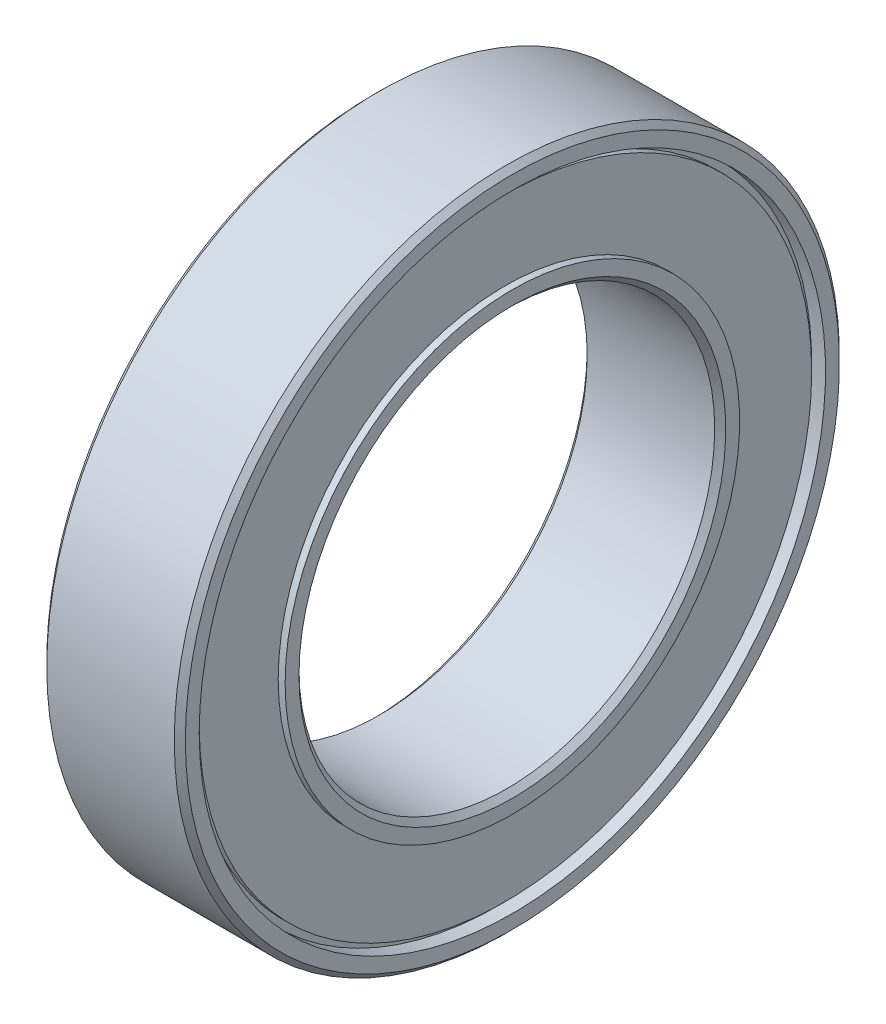
ISO-10303-21;
HEADER;
FILE_DESCRIPTION(('STEP AP214'),'2;1');
FILE_NAME('part.step','',(''),(''),'','','');
FILE_SCHEMA(('AUTOMOTIVE_DESIGN { 1 0 10303 214 1 1 1 1 }'));
ENDSEC;
DATA;
#1=APPLICATION_CONTEXT('core data for automotive mechanical design processes');
#2=APPLICATION_PROTOCOL_DEFINITION('international standard','automotive_design',2000,#1);
#3=PRODUCT_CONTEXT('',#1,'mechanical');
#4=PRODUCT('Part','Part','',(#3));
#5=PRODUCT_RELATED_PRODUCT_CATEGORY('part','',(#4));
#6=PRODUCT_DEFINITION_FORMATION('','',#4);
#7=PRODUCT_DEFINITION_CONTEXT('part definition',#1,'design');
#8=PRODUCT_DEFINITION('design','',#6,#7);
#9=PRODUCT_DEFINITION_SHAPE('','',#8);
#10=(LENGTH_UNIT() NAMED_UNIT(*) SI_UNIT(.MILLI.,.METRE.));
#11=(NAMED_UNIT(*) PLANE_ANGLE_UNIT() SI_UNIT($,.RADIAN.));
#12=(NAMED_UNIT(*) SI_UNIT($,.STERADIAN.) SOLID_ANGLE_UNIT());
#13=UNCERTAINTY_MEASURE_WITH_UNIT(LENGTH_MEASURE(1.E-05),#10,'distance_accuracy_value','');
#14=(GEOMETRIC_REPRESENTATION_CONTEXT(3) GLOBAL_UNCERTAINTY_ASSIGNED_CONTEXT((#13)) GLOBAL_UNIT_ASSIGNED_CONTEXT((#10,
#11,#12)) REPRESENTATION_CONTEXT('',''));
#15=CARTESIAN_POINT('',(0.,0.,0.));
#16=DIRECTION('',(0.,0.,1.));
#17=DIRECTION('',(1.,0.,0.));
#18=AXIS2_PLACEMENT_3D('',#15,#16,#17);
#19=CARTESIAN_POINT('',(-2.5,11.3,0.));
#20=DIRECTION('',(1.,0.,0.));
#21=DIRECTION('',(0.,0.,-1.));
#22=AXIS2_PLACEMENT_3D('',#19,#20,#21);
#23=PLANE('',#22);
#24=CARTESIAN_POINT('',(-2.5,0.,0.));
#25=DIRECTION('',(1.,0.,0.));
#26=DIRECTION('',(0.,0.,-1.));
#27=AXIS2_PLACEMENT_3D('',#24,#25,#26);
#28=CIRCLE('',#27,11.8);
#29=CARTESIAN_POINT('',(-2.5,0.,-11.8));
#30=VERTEX_POINT('',#29);
#31=EDGE_CURVE('E10',#30,#30,#28,.F.);
#32=ORIENTED_EDGE('',*,*,#31,.T.);
#33=EDGE_LOOP('',(#32));
#34=FACE_BOUND('',#33,.T.);
#35=CARTESIAN_POINT('',(-2.5,0.,0.));
#36=DIRECTION('',(-1.,0.,0.));
#37=DIRECTION('',(0.,0.,1.));
#38=AXIS2_PLACEMENT_3D('',#35,#36,#37);
#39=CIRCLE('',#38,11.3);
#40=CARTESIAN_POINT('',(-2.5,0.,11.3));
#41=VERTEX_POINT('',#40);
#42=EDGE_CURVE('E68',#41,#41,#39,.T.);
#43=ORIENTED_EDGE('',*,*,#42,.F.);
#44=EDGE_LOOP('',(#43));
#45=FACE_BOUND('',#44,.T.);
#46=ADVANCED_FACE('F35',(#34,#45),#23,.F.);
#47=CARTESIAN_POINT('',(-3.90102380964335,0.,0.));
#48=DIRECTION('',(-1.,0.,0.));
#49=DIRECTION('',(0.,0.,1.));
#50=AXIS2_PLACEMENT_3D('',#47,#48,#49);
#51=CYLINDRICAL_SURFACE('',#50,11.3);
#52=CARTESIAN_POINT('',(-2.,0.,0.));
#53=DIRECTION('',(-1.,0.,0.));
#54=DIRECTION('',(0.,0.,1.));
#55=AXIS2_PLACEMENT_3D('',#52,#53,#54);
#56=CIRCLE('',#55,11.3);
#57=CARTESIAN_POINT('',(-2.,0.,11.3));
#58=VERTEX_POINT('',#57);
#59=EDGE_CURVE('E71',#58,#58,#56,.T.);
#60=ORIENTED_EDGE('',*,*,#59,.F.);
#61=EDGE_LOOP('',(#60));
#62=FACE_BOUND('',#61,.T.);
#63=ORIENTED_EDGE('',*,*,#42,.T.);
#64=EDGE_LOOP('',(#63));
#65=FACE_BOUND('',#64,.T.);
#66=ADVANCED_FACE('F149',(#62,#65),#51,.F.);
#67=CARTESIAN_POINT('',(-2.,11.05,0.));
#68=DIRECTION('',(1.,0.,0.));
#69=DIRECTION('',(0.,0.,-1.));
#70=AXIS2_PLACEMENT_3D('',#67,#68,#69);
#71=PLANE('',#70);
#72=CARTESIAN_POINT('',(-2.,0.,0.));
#73=DIRECTION('',(-1.,0.,0.));
#74=DIRECTION('',(0.,0.,1.));
#75=AXIS2_PLACEMENT_3D('',#72,#73,#74);
#76=CIRCLE('',#75,11.05);
#77=CARTESIAN_POINT('',(-2.,0.,11.05));
#78=VERTEX_POINT('',#77);
#79=EDGE_CURVE('E74',#78,#78,#76,.T.);
#80=ORIENTED_EDGE('',*,*,#79,.F.);
#81=EDGE_LOOP('',(#80));
#82=FACE_BOUND('',#81,.T.);
#83=ORIENTED_EDGE('',*,*,#59,.T.);
#84=EDGE_LOOP('',(#83));
#85=FACE_BOUND('',#84,.T.);
#86=ADVANCED_FACE('F154',(#82,#85),#71,.F.);
#87=CARTESIAN_POINT('',(-3.90102380964335,0.,0.));
#88=DIRECTION('',(-1.,0.,0.));
#89=DIRECTION('',(0.,0.,1.));
#90=AXIS2_PLACEMENT_3D('',#87,#88,#89);
#91=CYLINDRICAL_SURFACE('',#90,11.05);
#92=CARTESIAN_POINT('',(-2.25,0.,0.));
#93=DIRECTION('',(-1.,0.,0.));
#94=DIRECTION('',(0.,0.,1.));
#95=AXIS2_PLACEMENT_3D('',#92,#93,#94);
#96=CIRCLE('',#95,11.05);
#97=CARTESIAN_POINT('',(-2.25,0.,11.05));
#98=VERTEX_POINT('',#97);
#99=EDGE_CURVE('E77',#98,#98,#96,.T.);
#100=ORIENTED_EDGE('',*,*,#99,.F.);
#101=EDGE_LOOP('',(#100));
#102=FACE_BOUND('',#101,.T.);
#103=ORIENTED_EDGE('',*,*,#79,.T.);
#104=EDGE_LOOP('',(#103));
#105=FACE_BOUND('',#104,.T.);
#106=ADVANCED_FACE('F241',(#102,#105),#91,.T.);
#107=CARTESIAN_POINT('',(-2.25,8.2,0.));
#108=DIRECTION('',(1.,0.,0.));
#109=DIRECTION('',(0.,0.,-1.));
#110=AXIS2_PLACEMENT_3D('',#107,#108,#109);
#111=PLANE('',#110);
#112=CARTESIAN_POINT('',(-2.25,0.,0.));
#113=DIRECTION('',(-1.,0.,0.));
#114=DIRECTION('',(0.,0.,1.));
#115=AXIS2_PLACEMENT_3D('',#112,#113,#114);
#116=CIRCLE('',#115,8.2);
#117=CARTESIAN_POINT('',(-2.25,0.,8.2));
#118=VERTEX_POINT('',#117);
#119=EDGE_CURVE('E80',#118,#118,#116,.T.);
#120=ORIENTED_EDGE('',*,*,#119,.F.);
#121=EDGE_LOOP('',(#120));
#122=FACE_BOUND('',#121,.T.);
#123=ORIENTED_EDGE('',*,*,#99,.T.);
#124=EDGE_LOOP('',(#123));
#125=FACE_BOUND('',#124,.T.);
#126=ADVANCED_FACE('F229',(#122,#125),#111,.F.);
#127=CARTESIAN_POINT('',(-3.90102380964335,0.,0.));
#128=DIRECTION('',(-1.,0.,0.));
#129=DIRECTION('',(0.,0.,1.));
#130=AXIS2_PLACEMENT_3D('',#127,#128,#129);
#131=CYLINDRICAL_SURFACE('',#130,8.2);
#132=CARTESIAN_POINT('',(-2.5,0.,0.));
#133=DIRECTION('',(-1.,0.,0.));
#134=DIRECTION('',(0.,0.,1.));
#135=AXIS2_PLACEMENT_3D('',#132,#133,#134);
#136=CIRCLE('',#135,8.2);
#137=CARTESIAN_POINT('',(-2.5,0.,8.2));
#138=VERTEX_POINT('',#137);
#139=EDGE_CURVE('E83',#138,#138,#136,.T.);
#140=ORIENTED_EDGE('',*,*,#139,.F.);
#141=EDGE_LOOP('',(#140));
#142=FACE_BOUND('',#141,.T.);
#143=ORIENTED_EDGE('',*,*,#119,.T.);
#144=EDGE_LOOP('',(#143));
#145=FACE_BOUND('',#144,.T.);
#146=ADVANCED_FACE('F224',(#142,#145),#131,.T.);
#147=CARTESIAN_POINT('',(-2.5,7.5,0.));
#148=DIRECTION('',(1.,0.,0.));
#149=DIRECTION('',(0.,0.,-1.));
#150=AXIS2_PLACEMENT_3D('',#147,#148,#149);
#151=PLANE('',#150);
#152=CARTESIAN_POINT('',(-2.5,0.,0.));
#153=DIRECTION('',(1.,0.,0.));
#154=DIRECTION('',(0.,0.,-1.));
#155=AXIS2_PLACEMENT_3D('',#152,#153,#154);
#156=CIRCLE('',#155,7.7);
#157=CARTESIAN_POINT('',(-2.5,0.,-7.7));
#158=VERTEX_POINT('',#157);
#159=EDGE_CURVE('E59',#158,#158,#156,.T.);
#160=ORIENTED_EDGE('',*,*,#159,.T.);
#161=EDGE_LOOP('',(#160));
#162=FACE_BOUND('',#161,.T.);
#163=ORIENTED_EDGE('',*,*,#139,.T.);
#164=EDGE_LOOP('',(#163));
#165=FACE_BOUND('',#164,.T.);
#166=ADVANCED_FACE('F145',(#162,#165),#151,.F.);
#167=CARTESIAN_POINT('',(-3.90102380964335,0.,0.));
#168=DIRECTION('',(-1.,0.,0.));
#169=DIRECTION('',(0.,0.,1.));
#170=AXIS2_PLACEMENT_3D('',#167,#168,#169);
#171=CYLINDRICAL_SURFACE('',#170,7.5);
#172=CARTESIAN_POINT('',(-2.3,0.,0.));
#173=DIRECTION('',(1.,0.,0.));
#174=DIRECTION('',(0.,0.,-1.));
#175=AXIS2_PLACEMENT_3D('',#172,#173,#174);
#176=CIRCLE('',#175,7.5);
#177=CARTESIAN_POINT('',(-2.3,0.,-7.5));
#178=VERTEX_POINT('',#177);
#179=EDGE_CURVE('E62',#178,#178,#176,.F.);
#180=ORIENTED_EDGE('',*,*,#179,.T.);
#181=EDGE_LOOP('',(#180));
#182=FACE_BOUND('',#181,.T.);
#183=CARTESIAN_POINT('',(2.3,0.,0.));
#184=DIRECTION('',(-1.,0.,0.));
#185=DIRECTION('',(0.,0.,1.));
#186=AXIS2_PLACEMENT_3D('',#183,#184,#185);
#187=CIRCLE('',#186,7.5);
#188=CARTESIAN_POINT('',(2.3,0.,7.5));
#189=VERTEX_POINT('',#188);
#190=EDGE_CURVE('E65',#189,#189,#187,.F.);
#191=ORIENTED_EDGE('',*,*,#190,.T.);
#192=EDGE_LOOP('',(#191));
#193=FACE_BOUND('',#192,.T.);
#194=ADVANCED_FACE('F139',(#182,#193),#171,.F.);
#195=CARTESIAN_POINT('',(2.5,7.5,0.));
#196=DIRECTION('',(-1.,0.,0.));
#197=DIRECTION('',(0.,0.,1.));
#198=AXIS2_PLACEMENT_3D('',#195,#196,#197);
#199=PLANE('',#198);
#200=CARTESIAN_POINT('',(2.5,0.,0.));
#201=DIRECTION('',(-1.,0.,0.));
#202=DIRECTION('',(0.,0.,1.));
#203=AXIS2_PLACEMENT_3D('',#200,#201,#202);
#204=CIRCLE('',#203,7.69999999999999);
#205=CARTESIAN_POINT('',(2.5,0.,7.69999999999999));
#206=VERTEX_POINT('',#205);
#207=EDGE_CURVE('E56',#206,#206,#204,.T.);
#208=ORIENTED_EDGE('',*,*,#207,.T.);
#209=EDGE_LOOP('',(#208));
#210=FACE_BOUND('',#209,.T.);
#211=CARTESIAN_POINT('',(2.5,0.,0.));
#212=DIRECTION('',(-1.,0.,0.));
#213=DIRECTION('',(0.,0.,1.));
#214=AXIS2_PLACEMENT_3D('',#211,#212,#213);
#215=CIRCLE('',#214,8.2);
#216=CARTESIAN_POINT('',(2.5,0.,8.2));
#217=VERTEX_POINT('',#216);
#218=EDGE_CURVE('E86',#217,#217,#215,.T.);
#219=ORIENTED_EDGE('',*,*,#218,.F.);
#220=EDGE_LOOP('',(#219));
#221=FACE_BOUND('',#220,.T.);
#222=ADVANCED_FACE('F134',(#210,#221),#199,.F.);
#223=CARTESIAN_POINT('',(-3.90102380964335,0.,0.));
#224=DIRECTION('',(-1.,0.,0.));
#225=DIRECTION('',(0.,0.,1.));
#226=AXIS2_PLACEMENT_3D('',#223,#224,#225);
#227=CYLINDRICAL_SURFACE('',#226,8.2);
#228=CARTESIAN_POINT('',(2.25,0.,0.));
#229=DIRECTION('',(-1.,0.,0.));
#230=DIRECTION('',(0.,0.,1.));
#231=AXIS2_PLACEMENT_3D('',#228,#229,#230);
#232=CIRCLE('',#231,8.2);
#233=CARTESIAN_POINT('',(2.25,0.,8.2));
#234=VERTEX_POINT('',#233);
#235=EDGE_CURVE('E89',#234,#234,#232,.T.);
#236=ORIENTED_EDGE('',*,*,#235,.F.);
#237=EDGE_LOOP('',(#236));
#238=FACE_BOUND('',#237,.T.);
#239=ORIENTED_EDGE('',*,*,#218,.T.);
#240=EDGE_LOOP('',(#239));
#241=FACE_BOUND('',#240,.T.);
#242=ADVANCED_FACE('F128',(#238,#241),#227,.T.);
#243=CARTESIAN_POINT('',(2.25,8.2,0.));
#244=DIRECTION('',(-1.,0.,0.));
#245=DIRECTION('',(0.,0.,1.));
#246=AXIS2_PLACEMENT_3D('',#243,#244,#245);
#247=PLANE('',#246);
#248=CARTESIAN_POINT('',(2.25,0.,0.));
#249=DIRECTION('',(-1.,0.,0.));
#250=DIRECTION('',(0.,0.,1.));
#251=AXIS2_PLACEMENT_3D('',#248,#249,#250);
#252=CIRCLE('',#251,11.05);
#253=CARTESIAN_POINT('',(2.25,0.,11.05));
#254=VERTEX_POINT('',#253);
#255=EDGE_CURVE('E92',#254,#254,#252,.T.);
#256=ORIENTED_EDGE('',*,*,#255,.F.);
#257=EDGE_LOOP('',(#256));
#258=FACE_BOUND('',#257,.T.);
#259=ORIENTED_EDGE('',*,*,#235,.T.);
#260=EDGE_LOOP('',(#259));
#261=FACE_BOUND('',#260,.T.);
#262=ADVANCED_FACE('F122',(#258,#261),#247,.F.);
#263=CARTESIAN_POINT('',(-3.90102380964335,0.,0.));
#264=DIRECTION('',(-1.,0.,0.));
#265=DIRECTION('',(0.,0.,1.));
#266=AXIS2_PLACEMENT_3D('',#263,#264,#265);
#267=CYLINDRICAL_SURFACE('',#266,11.05);
#268=CARTESIAN_POINT('',(2.,0.,0.));
#269=DIRECTION('',(-1.,0.,0.));
#270=DIRECTION('',(0.,0.,1.));
#271=AXIS2_PLACEMENT_3D('',#268,#269,#270);
#272=CIRCLE('',#271,11.05);
#273=CARTESIAN_POINT('',(2.,0.,11.05));
#274=VERTEX_POINT('',#273);
#275=EDGE_CURVE('E95',#274,#274,#272,.T.);
#276=ORIENTED_EDGE('',*,*,#275,.F.);
#277=EDGE_LOOP('',(#276));
#278=FACE_BOUND('',#277,.T.);
#279=ORIENTED_EDGE('',*,*,#255,.T.);
#280=EDGE_LOOP('',(#279));
#281=FACE_BOUND('',#280,.T.);
#282=ADVANCED_FACE('F116',(#278,#281),#267,.T.);
#283=CARTESIAN_POINT('',(2.,11.05,0.));
#284=DIRECTION('',(-1.,0.,0.));
#285=DIRECTION('',(0.,0.,1.));
#286=AXIS2_PLACEMENT_3D('',#283,#284,#285);
#287=PLANE('',#286);
#288=CARTESIAN_POINT('',(2.,0.,0.));
#289=DIRECTION('',(-1.,0.,0.));
#290=DIRECTION('',(0.,0.,1.));
#291=AXIS2_PLACEMENT_3D('',#288,#289,#290);
#292=CIRCLE('',#291,11.3);
#293=CARTESIAN_POINT('',(2.,0.,11.3));
#294=VERTEX_POINT('',#293);
#295=EDGE_CURVE('E98',#294,#294,#292,.T.);
#296=ORIENTED_EDGE('',*,*,#295,.F.);
#297=EDGE_LOOP('',(#296));
#298=FACE_BOUND('',#297,.T.);
#299=ORIENTED_EDGE('',*,*,#275,.T.);
#300=EDGE_LOOP('',(#299));
#301=FACE_BOUND('',#300,.T.);
#302=ADVANCED_FACE('F110',(#298,#301),#287,.F.);
#303=CARTESIAN_POINT('',(-3.90102380964335,0.,0.));
#304=DIRECTION('',(-1.,0.,0.));
#305=DIRECTION('',(0.,0.,1.));
#306=AXIS2_PLACEMENT_3D('',#303,#304,#305);
#307=CYLINDRICAL_SURFACE('',#306,11.3);
#308=CARTESIAN_POINT('',(2.5,0.,0.));
#309=DIRECTION('',(-1.,0.,0.));
#310=DIRECTION('',(0.,0.,1.));
#311=AXIS2_PLACEMENT_3D('',#308,#309,#310);
#312=CIRCLE('',#311,11.3);
#313=CARTESIAN_POINT('',(2.5,0.,11.3));
#314=VERTEX_POINT('',#313);
#315=EDGE_CURVE('E101',#314,#314,#312,.T.);
#316=ORIENTED_EDGE('',*,*,#315,.F.);
#317=EDGE_LOOP('',(#316));
#318=FACE_BOUND('',#317,.T.);
#319=ORIENTED_EDGE('',*,*,#295,.T.);
#320=EDGE_LOOP('',(#319));
#321=FACE_BOUND('',#320,.T.);
#322=ADVANCED_FACE('F107',(#318,#321),#307,.F.);
#323=CARTESIAN_POINT('',(2.5,11.3,0.));
#324=DIRECTION('',(-1.,0.,0.));
#325=DIRECTION('',(0.,0.,1.));
#326=AXIS2_PLACEMENT_3D('',#323,#324,#325);
#327=PLANE('',#326);
#328=CARTESIAN_POINT('',(2.5,0.,0.));
#329=DIRECTION('',(-1.,0.,0.));
#330=DIRECTION('',(0.,0.,1.));
#331=AXIS2_PLACEMENT_3D('',#328,#329,#330);
#332=CIRCLE('',#331,11.8);
#333=CARTESIAN_POINT('',(2.5,0.,11.8));
#334=VERTEX_POINT('',#333);
#335=EDGE_CURVE('E43',#334,#334,#332,.F.);
#336=ORIENTED_EDGE('',*,*,#335,.T.);
#337=EDGE_LOOP('',(#336));
#338=FACE_BOUND('',#337,.T.);
#339=ORIENTED_EDGE('',*,*,#315,.T.);
#340=EDGE_LOOP('',(#339));
#341=FACE_BOUND('',#340,.T.);
#342=ADVANCED_FACE('F105',(#338,#341),#327,.F.);
#343=CARTESIAN_POINT('',(-3.90102380964335,0.,0.));
#344=DIRECTION('',(-1.,0.,0.));
#345=DIRECTION('',(0.,0.,1.));
#346=AXIS2_PLACEMENT_3D('',#343,#344,#345);
#347=CYLINDRICAL_SURFACE('',#346,12.);
#348=CARTESIAN_POINT('',(2.3,0.,0.));
#349=DIRECTION('',(-1.,0.,0.));
#350=DIRECTION('',(0.,0.,1.));
#351=AXIS2_PLACEMENT_3D('',#348,#349,#350);
#352=CIRCLE('',#351,12.);
#353=CARTESIAN_POINT('',(2.3,0.,12.));
#354=VERTEX_POINT('',#353);
#355=EDGE_CURVE('E47',#354,#354,#352,.T.);
#356=ORIENTED_EDGE('',*,*,#355,.T.);
#357=EDGE_LOOP('',(#356));
#358=FACE_BOUND('',#357,.T.);
#359=CARTESIAN_POINT('',(-2.3,0.,0.));
#360=DIRECTION('',(1.,0.,0.));
#361=DIRECTION('',(0.,0.,-1.));
#362=AXIS2_PLACEMENT_3D('',#359,#360,#361);
#363=CIRCLE('',#362,12.);
#364=CARTESIAN_POINT('',(-2.3,0.,-12.));
#365=VERTEX_POINT('',#364);
#366=EDGE_CURVE('E51',#365,#365,#363,.T.);
#367=ORIENTED_EDGE('',*,*,#366,.T.);
#368=EDGE_LOOP('',(#367));
#369=FACE_BOUND('',#368,.T.);
#370=ADVANCED_FACE('F168',(#358,#369),#347,.T.);
#371=CARTESIAN_POINT('',(-2.3,0.,0.));
#372=DIRECTION('',(-1.,0.,0.));
#373=DIRECTION('',(0.,0.,1.));
#374=AXIS2_PLACEMENT_3D('',#371,#372,#373);
#375=CONICAL_SURFACE('',#374,7.5,0.785398163397459);
#376=ORIENTED_EDGE('',*,*,#159,.F.);
#377=EDGE_LOOP('',(#376));
#378=FACE_BOUND('',#377,.T.);
#379=ORIENTED_EDGE('',*,*,#179,.F.);
#380=EDGE_LOOP('',(#379));
#381=FACE_BOUND('',#380,.T.);
#382=ADVANCED_FACE('F161',(#378,#381),#375,.F.);
#383=CARTESIAN_POINT('',(2.5,0.,0.));
#384=DIRECTION('',(1.,0.,0.));
#385=DIRECTION('',(0.,0.,-1.));
#386=AXIS2_PLACEMENT_3D('',#383,#384,#385);
#387=CONICAL_SURFACE('',#386,7.69999999999999,0.785398163397448);
#388=ORIENTED_EDGE('',*,*,#190,.F.);
#389=EDGE_LOOP('',(#388));
#390=FACE_BOUND('',#389,.T.);
#391=ORIENTED_EDGE('',*,*,#207,.F.);
#392=EDGE_LOOP('',(#391));
#393=FACE_BOUND('',#392,.T.);
#394=ADVANCED_FACE('F167',(#390,#393),#387,.F.);
#395=CARTESIAN_POINT('',(2.3,0.,0.));
#396=DIRECTION('',(-1.,0.,0.));
#397=DIRECTION('',(0.,0.,1.));
#398=AXIS2_PLACEMENT_3D('',#395,#396,#397);
#399=CONICAL_SURFACE('',#398,12.,0.785398163397448);
#400=ORIENTED_EDGE('',*,*,#335,.F.);
#401=EDGE_LOOP('',(#400));
#402=FACE_BOUND('',#401,.T.);
#403=ORIENTED_EDGE('',*,*,#355,.F.);
#404=EDGE_LOOP('',(#403));
#405=FACE_BOUND('',#404,.T.);
#406=ADVANCED_FACE('F174',(#402,#405),#399,.T.);
#407=CARTESIAN_POINT('',(-2.5,0.,0.));
#408=DIRECTION('',(1.,0.,0.));
#409=DIRECTION('',(0.,0.,-1.));
#410=AXIS2_PLACEMENT_3D('',#407,#408,#409);
#411=CONICAL_SURFACE('',#410,11.8,0.785398163397444);
#412=ORIENTED_EDGE('',*,*,#366,.F.);
#413=EDGE_LOOP('',(#412));
#414=FACE_BOUND('',#413,.T.);
#415=ORIENTED_EDGE('',*,*,#31,.F.);
#416=EDGE_LOOP('',(#415));
#417=FACE_BOUND('',#416,.T.);
#418=ADVANCED_FACE('F38',(#414,#417),#411,.T.);
#419=CLOSED_SHELL('',(#46,#66,#86,#106,#126,#146,#166,#194,#222,#242,#262,#282,#302,#322,#342,
#370,#382,#394,#406,#418));
#420=MANIFOLD_SOLID_BREP('B2',#419);
#421=ADVANCED_BREP_SHAPE_REPRESENTATION('',(#18,#420),#14);
#422=SHAPE_DEFINITION_REPRESENTATION(#9,#421);
ENDSEC;
END-ISO-10303-21;
